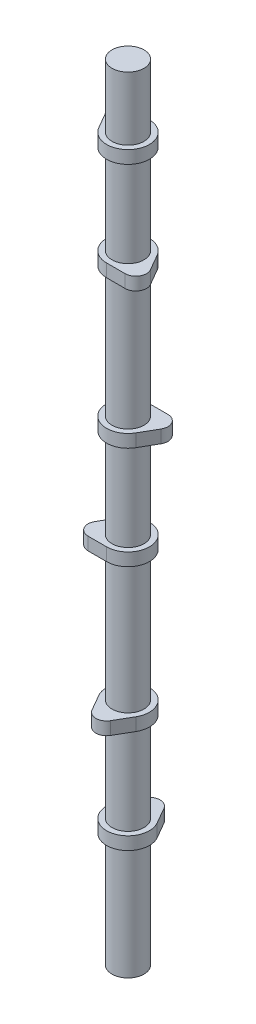
ISO-10303-21;
HEADER;
FILE_DESCRIPTION(('STEP AP214'),'2;1');
FILE_NAME('part.step','',(''),(''),'','','');
FILE_SCHEMA(('AUTOMOTIVE_DESIGN { 1 0 10303 214 1 1 1 1 }'));
ENDSEC;
DATA;
#1=APPLICATION_CONTEXT('core data for automotive mechanical design processes');
#2=APPLICATION_PROTOCOL_DEFINITION('international standard','automotive_design',2000,#1);
#3=PRODUCT_CONTEXT('',#1,'mechanical');
#4=PRODUCT('Part','Part','',(#3));
#5=PRODUCT_RELATED_PRODUCT_CATEGORY('part','',(#4));
#6=PRODUCT_DEFINITION_FORMATION('','',#4);
#7=PRODUCT_DEFINITION_CONTEXT('part definition',#1,'design');
#8=PRODUCT_DEFINITION('design','',#6,#7);
#9=PRODUCT_DEFINITION_SHAPE('','',#8);
#10=(LENGTH_UNIT() NAMED_UNIT(*) SI_UNIT(.MILLI.,.METRE.));
#11=(NAMED_UNIT(*) PLANE_ANGLE_UNIT() SI_UNIT($,.RADIAN.));
#12=(NAMED_UNIT(*) SI_UNIT($,.STERADIAN.) SOLID_ANGLE_UNIT());
#13=UNCERTAINTY_MEASURE_WITH_UNIT(LENGTH_MEASURE(1.E-05),#10,'distance_accuracy_value','');
#14=(GEOMETRIC_REPRESENTATION_CONTEXT(3) GLOBAL_UNCERTAINTY_ASSIGNED_CONTEXT((#13)) GLOBAL_UNIT_ASSIGNED_CONTEXT((#10,
#11,#12)) REPRESENTATION_CONTEXT('',''));
#15=CARTESIAN_POINT('',(0.,0.,0.));
#16=DIRECTION('',(0.,0.,1.));
#17=DIRECTION('',(1.,0.,0.));
#18=AXIS2_PLACEMENT_3D('',#15,#16,#17);
#19=CARTESIAN_POINT('',(0.,398.29,0.));
#20=DIRECTION('',(0.,-1.,0.));
#21=DIRECTION('',(0.,0.,-1.));
#22=AXIS2_PLACEMENT_3D('',#19,#20,#21);
#23=CYLINDRICAL_SURFACE('',#22,9.5);
#24=CARTESIAN_POINT('',(0.,214.63,0.));
#25=DIRECTION('',(0.,1.,0.));
#26=DIRECTION('',(0.,0.,1.));
#27=AXIS2_PLACEMENT_3D('',#24,#25,#26);
#28=CIRCLE('',#27,9.5);
#29=CARTESIAN_POINT('',(0.,214.63,9.5));
#30=VERTEX_POINT('',#29);
#31=EDGE_CURVE('E331',#30,#30,#28,.T.);
#32=ORIENTED_EDGE('',*,*,#31,.T.);
#33=EDGE_LOOP('',(#32));
#34=FACE_BOUND('',#33,.T.);
#35=CARTESIAN_POINT('',(0.,292.1,0.));
#36=DIRECTION('',(0.,1.,0.));
#37=DIRECTION('',(0.,0.,1.));
#38=AXIS2_PLACEMENT_3D('',#35,#36,#37);
#39=CIRCLE('',#38,9.5);
#40=CARTESIAN_POINT('',(0.,292.1,9.5));
#41=VERTEX_POINT('',#40);
#42=EDGE_CURVE('E11',#41,#41,#39,.T.);
#43=ORIENTED_EDGE('',*,*,#42,.F.);
#44=EDGE_LOOP('',(#43));
#45=FACE_BOUND('',#44,.T.);
#46=ADVANCED_FACE('F35',(#34,#45),#23,.T.);
#47=CARTESIAN_POINT('',(0.,68.58,0.));
#48=DIRECTION('',(0.,1.,0.));
#49=DIRECTION('',(0.,0.,1.));
#50=AXIS2_PLACEMENT_3D('',#47,#48,#49);
#51=CIRCLE('',#50,9.5);
#52=CARTESIAN_POINT('',(0.,68.58,9.5));
#53=VERTEX_POINT('',#52);
#54=EDGE_CURVE('E362',#53,#53,#51,.T.);
#55=ORIENTED_EDGE('',*,*,#54,.T.);
#56=EDGE_LOOP('',(#55));
#57=FACE_BOUND('',#56,.T.);
#58=CARTESIAN_POINT('',(0.,146.05,0.));
#59=DIRECTION('',(0.,1.,0.));
#60=DIRECTION('',(0.,0.,1.));
#61=AXIS2_PLACEMENT_3D('',#58,#59,#60);
#62=CIRCLE('',#61,9.5);
#63=CARTESIAN_POINT('',(0.,146.05,9.5));
#64=VERTEX_POINT('',#63);
#65=EDGE_CURVE('E404',#64,#64,#62,.T.);
#66=ORIENTED_EDGE('',*,*,#65,.F.);
#67=EDGE_LOOP('',(#66));
#68=FACE_BOUND('',#67,.T.);
#69=ADVANCED_FACE('F453',(#57,#68),#23,.T.);
#70=CARTESIAN_POINT('',(0.,7.62000000000002,0.));
#71=DIRECTION('',(0.,1.,0.));
#72=DIRECTION('',(0.,0.,1.));
#73=AXIS2_PLACEMENT_3D('',#70,#71,#72);
#74=CIRCLE('',#73,9.5);
#75=CARTESIAN_POINT('',(0.,7.62000000000002,9.5));
#76=VERTEX_POINT('',#75);
#77=EDGE_CURVE('E366',#76,#76,#74,.F.);
#78=ORIENTED_EDGE('',*,*,#77,.F.);
#79=EDGE_LOOP('',(#78));
#80=FACE_BOUND('',#79,.T.);
#81=CARTESIAN_POINT('',(0.,60.96,0.));
#82=DIRECTION('',(0.,1.,0.));
#83=DIRECTION('',(0.,0.,1.));
#84=AXIS2_PLACEMENT_3D('',#81,#82,#83);
#85=CIRCLE('',#84,9.5);
#86=CARTESIAN_POINT('',(0.,60.96,9.5));
#87=VERTEX_POINT('',#86);
#88=EDGE_CURVE('E396',#87,#87,#85,.T.);
#89=ORIENTED_EDGE('',*,*,#88,.F.);
#90=EDGE_LOOP('',(#89));
#91=FACE_BOUND('',#90,.T.);
#92=ADVANCED_FACE('F461',(#80,#91),#23,.T.);
#93=CARTESIAN_POINT('',(0.,7.62,-12.7));
#94=DIRECTION('',(0.,-1.,0.));
#95=DIRECTION('',(0.,0.,-1.));
#96=AXIS2_PLACEMENT_3D('',#93,#94,#95);
#97=CYLINDRICAL_SURFACE('',#96,6.35);
#98=CARTESIAN_POINT('',(0.,0.,-12.7));
#99=DIRECTION('',(0.,1.,0.));
#100=DIRECTION('',(0.,0.,1.));
#101=AXIS2_PLACEMENT_3D('',#98,#99,#100);
#102=CIRCLE('',#101,6.35);
#103=CARTESIAN_POINT('',(5.49926131403119,0.,-15.875));
#104=VERTEX_POINT('',#103);
#105=CARTESIAN_POINT('',(-5.49926131403118,0.,-15.875));
#106=VERTEX_POINT('',#105);
#107=EDGE_CURVE('E372',#104,#106,#102,.T.);
#108=ORIENTED_EDGE('',*,*,#107,.T.);
#109=DIRECTION('',(0.,-1.,0.));
#110=VECTOR('',#109,1.);
#111=CARTESIAN_POINT('',(-5.49926131403118,7.62,-15.875));
#112=LINE('',#111,#110);
#113=CARTESIAN_POINT('',(-5.49926131403118,7.62,-15.875));
#114=VERTEX_POINT('',#113);
#115=EDGE_CURVE('E391',#114,#106,#112,.T.);
#116=ORIENTED_EDGE('',*,*,#115,.F.);
#117=CARTESIAN_POINT('',(0.,7.62,-12.7));
#118=DIRECTION('',(0.,1.,0.));
#119=DIRECTION('',(0.,0.,1.));
#120=AXIS2_PLACEMENT_3D('',#117,#118,#119);
#121=CIRCLE('',#120,6.35);
#122=CARTESIAN_POINT('',(5.49926131403119,7.62,-15.875));
#123=VERTEX_POINT('',#122);
#124=EDGE_CURVE('E373',#123,#114,#121,.T.);
#125=ORIENTED_EDGE('',*,*,#124,.F.);
#126=DIRECTION('',(0.,-1.,0.));
#127=VECTOR('',#126,1.);
#128=CARTESIAN_POINT('',(5.49926131403119,7.62,-15.875));
#129=LINE('',#128,#127);
#130=EDGE_CURVE('E379',#123,#104,#129,.T.);
#131=ORIENTED_EDGE('',*,*,#130,.T.);
#132=EDGE_LOOP('',(#108,#116,#125,#131));
#133=FACE_BOUND('',#132,.T.);
#134=ADVANCED_FACE('F37',(#133),#97,.T.);
#135=CARTESIAN_POINT('',(-5.49926131403118,7.62,-15.875));
#136=DIRECTION('',(0.866025403784439,0.,0.5));
#137=DIRECTION('',(0.5,0.,-0.866025403784439));
#138=AXIS2_PLACEMENT_3D('',#135,#136,#137);
#139=PLANE('',#138);
#140=DIRECTION('',(-0.5,0.,0.866025403784439));
#141=VECTOR('',#140,1.);
#142=CARTESIAN_POINT('',(-5.49926131403118,0.,-15.875));
#143=LINE('',#142,#141);
#144=CARTESIAN_POINT('',(-10.9985226280624,0.,-6.35));
#145=VERTEX_POINT('',#144);
#146=EDGE_CURVE('E382',#106,#145,#143,.T.);
#147=ORIENTED_EDGE('',*,*,#146,.T.);
#148=DIRECTION('',(0.,-1.,0.));
#149=VECTOR('',#148,1.);
#150=CARTESIAN_POINT('',(-10.9985226280624,7.62,-6.35));
#151=LINE('',#150,#149);
#152=CARTESIAN_POINT('',(-10.9985226280624,7.62,-6.35));
#153=VERTEX_POINT('',#152);
#154=EDGE_CURVE('E389',#153,#145,#151,.T.);
#155=ORIENTED_EDGE('',*,*,#154,.F.);
#156=DIRECTION('',(-0.5,0.,0.866025403784439));
#157=VECTOR('',#156,1.);
#158=CARTESIAN_POINT('',(-5.49926131403118,7.62,-15.875));
#159=LINE('',#158,#157);
#160=EDGE_CURVE('E85',#114,#153,#159,.T.);
#161=ORIENTED_EDGE('',*,*,#160,.F.);
#162=ORIENTED_EDGE('',*,*,#115,.T.);
#163=EDGE_LOOP('',(#147,#155,#161,#162));
#164=FACE_BOUND('',#163,.T.);
#165=ADVANCED_FACE('F495',(#164),#139,.F.);
#166=CARTESIAN_POINT('',(0.,7.62,0.));
#167=DIRECTION('',(0.,-1.,0.));
#168=DIRECTION('',(0.,0.,-1.));
#169=AXIS2_PLACEMENT_3D('',#166,#167,#168);
#170=CYLINDRICAL_SURFACE('',#169,12.7);
#171=CARTESIAN_POINT('',(0.,0.,0.));
#172=DIRECTION('',(0.,1.,0.));
#173=DIRECTION('',(0.,0.,1.));
#174=AXIS2_PLACEMENT_3D('',#171,#172,#173);
#175=CIRCLE('',#174,12.7);
#176=CARTESIAN_POINT('',(10.9985226280624,0.,-6.35000000000001));
#177=VERTEX_POINT('',#176);
#178=EDGE_CURVE('E71',#145,#177,#175,.T.);
#179=ORIENTED_EDGE('',*,*,#178,.T.);
#180=DIRECTION('',(0.,-1.,0.));
#181=VECTOR('',#180,1.);
#182=CARTESIAN_POINT('',(10.9985226280624,7.62,-6.35000000000001));
#183=LINE('',#182,#181);
#184=CARTESIAN_POINT('',(10.9985226280624,7.62,-6.35000000000001));
#185=VERTEX_POINT('',#184);
#186=EDGE_CURVE('E387',#185,#177,#183,.T.);
#187=ORIENTED_EDGE('',*,*,#186,.F.);
#188=CARTESIAN_POINT('',(0.,7.62,0.));
#189=DIRECTION('',(0.,1.,0.));
#190=DIRECTION('',(0.,0.,1.));
#191=AXIS2_PLACEMENT_3D('',#188,#189,#190);
#192=CIRCLE('',#191,12.7);
#193=EDGE_CURVE('E376',#153,#185,#192,.T.);
#194=ORIENTED_EDGE('',*,*,#193,.F.);
#195=ORIENTED_EDGE('',*,*,#154,.T.);
#196=EDGE_LOOP('',(#179,#187,#194,#195));
#197=FACE_BOUND('',#196,.T.);
#198=ADVANCED_FACE('F854',(#197),#170,.T.);
#199=CARTESIAN_POINT('',(5.49926131403119,7.62,-15.875));
#200=DIRECTION('',(-0.866025403784439,0.,0.5));
#201=DIRECTION('',(0.5,0.,0.866025403784439));
#202=AXIS2_PLACEMENT_3D('',#199,#200,#201);
#203=PLANE('',#202);
#204=DIRECTION('',(-0.5,0.,-0.866025403784439));
#205=VECTOR('',#204,1.);
#206=CARTESIAN_POINT('',(5.49926131403119,0.,-15.875));
#207=LINE('',#206,#205);
#208=EDGE_CURVE('E77',#177,#104,#207,.T.);
#209=ORIENTED_EDGE('',*,*,#208,.T.);
#210=ORIENTED_EDGE('',*,*,#130,.F.);
#211=DIRECTION('',(-0.5,0.,-0.866025403784439));
#212=VECTOR('',#211,1.);
#213=CARTESIAN_POINT('',(5.49926131403119,7.62,-15.875));
#214=LINE('',#213,#212);
#215=EDGE_CURVE('E53',#185,#123,#214,.T.);
#216=ORIENTED_EDGE('',*,*,#215,.F.);
#217=ORIENTED_EDGE('',*,*,#186,.T.);
#218=EDGE_LOOP('',(#209,#210,#216,#217));
#219=FACE_BOUND('',#218,.T.);
#220=ADVANCED_FACE('F847',(#219),#203,.F.);
#221=CARTESIAN_POINT('',(0.,7.62,-12.7));
#222=DIRECTION('',(0.,1.,0.));
#223=DIRECTION('',(0.,0.,1.));
#224=AXIS2_PLACEMENT_3D('',#221,#222,#223);
#225=PLANE('',#224);
#226=ORIENTED_EDGE('',*,*,#77,.T.);
#227=EDGE_LOOP('',(#226));
#228=FACE_BOUND('',#227,.T.);
#229=ORIENTED_EDGE('',*,*,#124,.T.);
#230=ORIENTED_EDGE('',*,*,#160,.T.);
#231=ORIENTED_EDGE('',*,*,#193,.T.);
#232=ORIENTED_EDGE('',*,*,#215,.T.);
#233=EDGE_LOOP('',(#229,#230,#231,#232));
#234=FACE_BOUND('',#233,.T.);
#235=ADVANCED_FACE('F839',(#228,#234),#225,.T.);
#236=CARTESIAN_POINT('',(0.,0.,-12.7));
#237=DIRECTION('',(0.,1.,0.));
#238=DIRECTION('',(0.,0.,1.));
#239=AXIS2_PLACEMENT_3D('',#236,#237,#238);
#240=PLANE('',#239);
#241=CARTESIAN_POINT('',(0.,0.,0.));
#242=DIRECTION('',(0.,1.,0.));
#243=DIRECTION('',(0.,0.,1.));
#244=AXIS2_PLACEMENT_3D('',#241,#242,#243);
#245=CIRCLE('',#244,9.5);
#246=CARTESIAN_POINT('',(0.,0.,9.5));
#247=VERTEX_POINT('',#246);
#248=EDGE_CURVE('E393',#247,#247,#245,.F.);
#249=ORIENTED_EDGE('',*,*,#248,.F.);
#250=EDGE_LOOP('',(#249));
#251=FACE_BOUND('',#250,.T.);
#252=ORIENTED_EDGE('',*,*,#107,.F.);
#253=ORIENTED_EDGE('',*,*,#208,.F.);
#254=ORIENTED_EDGE('',*,*,#178,.F.);
#255=ORIENTED_EDGE('',*,*,#146,.F.);
#256=EDGE_LOOP('',(#252,#253,#254,#255));
#257=FACE_BOUND('',#256,.T.);
#258=ADVANCED_FACE('F487',(#251,#257),#240,.F.);
#259=CARTESIAN_POINT('',(0.,-67.8,0.));
#260=DIRECTION('',(0.,1.,0.));
#261=DIRECTION('',(0.,0.,1.));
#262=AXIS2_PLACEMENT_3D('',#259,#260,#261);
#263=PLANE('',#262);
#264=CARTESIAN_POINT('',(0.,-67.8,0.));
#265=DIRECTION('',(0.,1.,0.));
#266=DIRECTION('',(0.,0.,1.));
#267=AXIS2_PLACEMENT_3D('',#264,#265,#266);
#268=CIRCLE('',#267,9.5);
#269=CARTESIAN_POINT('',(0.,-67.8,9.5));
#270=VERTEX_POINT('',#269);
#271=EDGE_CURVE('E367',#270,#270,#268,.T.);
#272=ORIENTED_EDGE('',*,*,#271,.F.);
#273=EDGE_LOOP('',(#272));
#274=FACE_BOUND('',#273,.T.);
#275=ADVANCED_FACE('F478',(#274),#263,.F.);
#276=ORIENTED_EDGE('',*,*,#271,.T.);
#277=EDGE_LOOP('',(#276));
#278=FACE_BOUND('',#277,.T.);
#279=ORIENTED_EDGE('',*,*,#248,.T.);
#280=EDGE_LOOP('',(#279));
#281=FACE_BOUND('',#280,.T.);
#282=ADVANCED_FACE('F469',(#278,#281),#23,.T.);
#283=CARTESIAN_POINT('',(0.,68.58,12.7));
#284=DIRECTION('',(0.,-1.,0.));
#285=DIRECTION('',(0.,0.,1.));
#286=AXIS2_PLACEMENT_3D('',#283,#284,#285);
#287=CYLINDRICAL_SURFACE('',#286,6.35);
#288=CARTESIAN_POINT('',(0.,60.96,12.7));
#289=DIRECTION('',(0.,1.,0.));
#290=DIRECTION('',(0.,0.,-1.));
#291=AXIS2_PLACEMENT_3D('',#288,#289,#290);
#292=CIRCLE('',#291,6.35);
#293=CARTESIAN_POINT('',(-5.4992613140313,60.96,15.875));
#294=VERTEX_POINT('',#293);
#295=CARTESIAN_POINT('',(5.49926131403107,60.96,15.875));
#296=VERTEX_POINT('',#295);
#297=EDGE_CURVE('E343',#294,#296,#292,.T.);
#298=ORIENTED_EDGE('',*,*,#297,.T.);
#299=DIRECTION('',(0.,-1.,0.));
#300=VECTOR('',#299,1.);
#301=CARTESIAN_POINT('',(5.49926131403107,68.58,15.875));
#302=LINE('',#301,#300);
#303=CARTESIAN_POINT('',(5.49926131403107,68.58,15.875));
#304=VERTEX_POINT('',#303);
#305=EDGE_CURVE('E359',#304,#296,#302,.T.);
#306=ORIENTED_EDGE('',*,*,#305,.F.);
#307=CARTESIAN_POINT('',(0.,68.58,12.7));
#308=DIRECTION('',(0.,1.,0.));
#309=DIRECTION('',(0.,0.,-1.));
#310=AXIS2_PLACEMENT_3D('',#307,#308,#309);
#311=CIRCLE('',#310,6.35);
#312=CARTESIAN_POINT('',(-5.4992613140313,68.58,15.875));
#313=VERTEX_POINT('',#312);
#314=EDGE_CURVE('E332',#313,#304,#311,.T.);
#315=ORIENTED_EDGE('',*,*,#314,.F.);
#316=DIRECTION('',(0.,-1.,0.));
#317=VECTOR('',#316,1.);
#318=CARTESIAN_POINT('',(-5.4992613140313,68.58,15.875));
#319=LINE('',#318,#317);
#320=EDGE_CURVE('E342',#313,#294,#319,.T.);
#321=ORIENTED_EDGE('',*,*,#320,.T.);
#322=EDGE_LOOP('',(#298,#306,#315,#321));
#323=FACE_BOUND('',#322,.T.);
#324=ADVANCED_FACE('F477',(#323),#287,.T.);
#325=CARTESIAN_POINT('',(5.49926131403107,68.58,15.875));
#326=DIRECTION('',(-0.866025403784435,0.,-0.500000000000006));
#327=DIRECTION('',(-0.500000000000006,0.,0.866025403784435));
#328=AXIS2_PLACEMENT_3D('',#325,#326,#327);
#329=PLANE('',#328);
#330=DIRECTION('',(0.500000000000006,0.,-0.866025403784435));
#331=VECTOR('',#330,1.);
#332=CARTESIAN_POINT('',(5.49926131403107,60.96,15.875));
#333=LINE('',#332,#331);
#334=CARTESIAN_POINT('',(10.9985226280623,60.96,6.35000000000008));
#335=VERTEX_POINT('',#334);
#336=EDGE_CURVE('E346',#296,#335,#333,.T.);
#337=ORIENTED_EDGE('',*,*,#336,.T.);
#338=DIRECTION('',(0.,-1.,0.));
#339=VECTOR('',#338,1.);
#340=CARTESIAN_POINT('',(10.9985226280623,68.58,6.35000000000008));
#341=LINE('',#340,#339);
#342=CARTESIAN_POINT('',(10.9985226280623,68.58,6.35000000000008));
#343=VERTEX_POINT('',#342);
#344=EDGE_CURVE('E356',#343,#335,#341,.T.);
#345=ORIENTED_EDGE('',*,*,#344,.F.);
#346=DIRECTION('',(0.500000000000006,0.,-0.866025403784435));
#347=VECTOR('',#346,1.);
#348=CARTESIAN_POINT('',(5.49926131403107,68.58,15.875));
#349=LINE('',#348,#347);
#350=EDGE_CURVE('E335',#304,#343,#349,.T.);
#351=ORIENTED_EDGE('',*,*,#350,.F.);
#352=ORIENTED_EDGE('',*,*,#305,.T.);
#353=EDGE_LOOP('',(#337,#345,#351,#352));
#354=FACE_BOUND('',#353,.T.);
#355=ADVANCED_FACE('F484',(#354),#329,.F.);
#356=CARTESIAN_POINT('',(0.,68.58,0.));
#357=DIRECTION('',(0.,-1.,0.));
#358=DIRECTION('',(0.,0.,1.));
#359=AXIS2_PLACEMENT_3D('',#356,#357,#358);
#360=CYLINDRICAL_SURFACE('',#359,12.7);
#361=CARTESIAN_POINT('',(0.,60.96,0.));
#362=DIRECTION('',(0.,1.,0.));
#363=DIRECTION('',(0.,0.,-1.));
#364=AXIS2_PLACEMENT_3D('',#361,#362,#363);
#365=CIRCLE('',#364,12.7);
#366=CARTESIAN_POINT('',(-10.9985226280624,60.96,6.34999999999993));
#367=VERTEX_POINT('',#366);
#368=EDGE_CURVE('E348',#335,#367,#365,.T.);
#369=ORIENTED_EDGE('',*,*,#368,.T.);
#370=DIRECTION('',(0.,-1.,0.));
#371=VECTOR('',#370,1.);
#372=CARTESIAN_POINT('',(-10.9985226280624,68.58,6.34999999999993));
#373=LINE('',#372,#371);
#374=CARTESIAN_POINT('',(-10.9985226280624,68.58,6.34999999999993));
#375=VERTEX_POINT('',#374);
#376=EDGE_CURVE('E353',#375,#367,#373,.T.);
#377=ORIENTED_EDGE('',*,*,#376,.F.);
#378=CARTESIAN_POINT('',(0.,68.58,0.));
#379=DIRECTION('',(0.,1.,0.));
#380=DIRECTION('',(0.,0.,-1.));
#381=AXIS2_PLACEMENT_3D('',#378,#379,#380);
#382=CIRCLE('',#381,12.7);
#383=EDGE_CURVE('E338',#343,#375,#382,.T.);
#384=ORIENTED_EDGE('',*,*,#383,.F.);
#385=ORIENTED_EDGE('',*,*,#344,.T.);
#386=EDGE_LOOP('',(#369,#377,#384,#385));
#387=FACE_BOUND('',#386,.T.);
#388=ADVANCED_FACE('F567',(#387),#360,.T.);
#389=CARTESIAN_POINT('',(-5.4992613140313,68.58,15.875));
#390=DIRECTION('',(0.866025403784442,0.,-0.499999999999994));
#391=DIRECTION('',(-0.499999999999994,0.,-0.866025403784442));
#392=AXIS2_PLACEMENT_3D('',#389,#390,#391);
#393=PLANE('',#392);
#394=DIRECTION('',(0.499999999999994,0.,0.866025403784442));
#395=VECTOR('',#394,1.);
#396=CARTESIAN_POINT('',(-5.4992613140313,60.96,15.875));
#397=LINE('',#396,#395);
#398=EDGE_CURVE('E336',#367,#294,#397,.T.);
#399=ORIENTED_EDGE('',*,*,#398,.T.);
#400=ORIENTED_EDGE('',*,*,#320,.F.);
#401=DIRECTION('',(0.499999999999994,0.,0.866025403784442));
#402=VECTOR('',#401,1.);
#403=CARTESIAN_POINT('',(-5.4992613140313,68.58,15.875));
#404=LINE('',#403,#402);
#405=EDGE_CURVE('E340',#375,#313,#404,.T.);
#406=ORIENTED_EDGE('',*,*,#405,.F.);
#407=ORIENTED_EDGE('',*,*,#376,.T.);
#408=EDGE_LOOP('',(#399,#400,#406,#407));
#409=FACE_BOUND('',#408,.T.);
#410=ADVANCED_FACE('F560',(#409),#393,.F.);
#411=CARTESIAN_POINT('',(0.,68.58,12.7));
#412=DIRECTION('',(0.,1.,0.));
#413=DIRECTION('',(0.,0.,-1.));
#414=AXIS2_PLACEMENT_3D('',#411,#412,#413);
#415=PLANE('',#414);
#416=ORIENTED_EDGE('',*,*,#54,.F.);
#417=EDGE_LOOP('',(#416));
#418=FACE_BOUND('',#417,.T.);
#419=ORIENTED_EDGE('',*,*,#314,.T.);
#420=ORIENTED_EDGE('',*,*,#350,.T.);
#421=ORIENTED_EDGE('',*,*,#383,.T.);
#422=ORIENTED_EDGE('',*,*,#405,.T.);
#423=EDGE_LOOP('',(#419,#420,#421,#422));
#424=FACE_BOUND('',#423,.T.);
#425=ADVANCED_FACE('F556',(#418,#424),#415,.T.);
#426=CARTESIAN_POINT('',(0.,60.96,12.7));
#427=DIRECTION('',(0.,1.,0.));
#428=DIRECTION('',(0.,0.,-1.));
#429=AXIS2_PLACEMENT_3D('',#426,#427,#428);
#430=PLANE('',#429);
#431=ORIENTED_EDGE('',*,*,#88,.T.);
#432=EDGE_LOOP('',(#431));
#433=FACE_BOUND('',#432,.T.);
#434=ORIENTED_EDGE('',*,*,#297,.F.);
#435=ORIENTED_EDGE('',*,*,#398,.F.);
#436=ORIENTED_EDGE('',*,*,#368,.F.);
#437=ORIENTED_EDGE('',*,*,#336,.F.);
#438=EDGE_LOOP('',(#434,#435,#436,#437));
#439=FACE_BOUND('',#438,.T.);
#440=ADVANCED_FACE('F559',(#433,#439),#430,.F.);
#441=CARTESIAN_POINT('',(-10.9985226280623,153.67,6.35000000000005));
#442=DIRECTION('',(0.,-1.,0.));
#443=DIRECTION('',(-0.866025403784436,0.,0.500000000000004));
#444=AXIS2_PLACEMENT_3D('',#441,#442,#443);
#445=CYLINDRICAL_SURFACE('',#444,6.35);
#446=CARTESIAN_POINT('',(-10.9985226280623,146.05,6.35000000000005));
#447=DIRECTION('',(0.,1.,0.));
#448=DIRECTION('',(0.866025403784436,0.,-0.500000000000004));
#449=AXIS2_PLACEMENT_3D('',#446,#447,#448);
#450=CIRCLE('',#449,6.35);
#451=CARTESIAN_POINT('',(-16.4977839420935,146.05,3.17500000000008));
#452=VERTEX_POINT('',#451);
#453=CARTESIAN_POINT('',(-10.9985226280623,146.05,12.7000000000001));
#454=VERTEX_POINT('',#453);
#455=EDGE_CURVE('E281',#452,#454,#450,.T.);
#456=ORIENTED_EDGE('',*,*,#455,.T.);
#457=DIRECTION('',(0.,-1.,0.));
#458=VECTOR('',#457,1.);
#459=CARTESIAN_POINT('',(-10.9985226280623,153.67,12.7000000000001));
#460=LINE('',#459,#458);
#461=CARTESIAN_POINT('',(-10.9985226280623,153.67,12.7000000000001));
#462=VERTEX_POINT('',#461);
#463=EDGE_CURVE('E297',#462,#454,#460,.T.);
#464=ORIENTED_EDGE('',*,*,#463,.F.);
#465=CARTESIAN_POINT('',(-10.9985226280623,153.67,6.35000000000005));
#466=DIRECTION('',(0.,1.,0.));
#467=DIRECTION('',(0.866025403784436,0.,-0.500000000000004));
#468=AXIS2_PLACEMENT_3D('',#465,#466,#467);
#469=CIRCLE('',#468,6.35);
#470=CARTESIAN_POINT('',(-16.4977839420935,153.67,3.17500000000008));
#471=VERTEX_POINT('',#470);
#472=EDGE_CURVE('E270',#471,#462,#469,.T.);
#473=ORIENTED_EDGE('',*,*,#472,.F.);
#474=DIRECTION('',(0.,-1.,0.));
#475=VECTOR('',#474,1.);
#476=CARTESIAN_POINT('',(-16.4977839420935,153.67,3.17500000000008));
#477=LINE('',#476,#475);
#478=EDGE_CURVE('E280',#471,#452,#477,.T.);
#479=ORIENTED_EDGE('',*,*,#478,.T.);
#480=EDGE_LOOP('',(#456,#464,#473,#479));
#481=FACE_BOUND('',#480,.T.);
#482=ADVANCED_FACE('F547',(#481),#445,.T.);
#483=CARTESIAN_POINT('',(-10.9985226280623,153.67,12.7000000000001));
#484=DIRECTION('',(0.,0.,-1.));
#485=DIRECTION('',(-1.,0.,0.));
#486=AXIS2_PLACEMENT_3D('',#483,#484,#485);
#487=PLANE('',#486);
#488=DIRECTION('',(1.,0.,0.));
#489=VECTOR('',#488,1.);
#490=CARTESIAN_POINT('',(-10.9985226280623,146.05,12.7000000000001));
#491=LINE('',#490,#489);
#492=CARTESIAN_POINT('',(0.,146.05,12.7));
#493=VERTEX_POINT('',#492);
#494=EDGE_CURVE('E284',#454,#493,#491,.T.);
#495=ORIENTED_EDGE('',*,*,#494,.T.);
#496=DIRECTION('',(0.,-1.,0.));
#497=VECTOR('',#496,1.);
#498=CARTESIAN_POINT('',(0.,153.67,12.7));
#499=LINE('',#498,#497);
#500=CARTESIAN_POINT('',(0.,153.67,12.7));
#501=VERTEX_POINT('',#500);
#502=EDGE_CURVE('E294',#501,#493,#499,.T.);
#503=ORIENTED_EDGE('',*,*,#502,.F.);
#504=DIRECTION('',(1.,0.,0.));
#505=VECTOR('',#504,1.);
#506=CARTESIAN_POINT('',(-10.9985226280623,153.67,12.7000000000001));
#507=LINE('',#506,#505);
#508=EDGE_CURVE('E273',#462,#501,#507,.T.);
#509=ORIENTED_EDGE('',*,*,#508,.F.);
#510=ORIENTED_EDGE('',*,*,#463,.T.);
#511=EDGE_LOOP('',(#495,#503,#509,#510));
#512=FACE_BOUND('',#511,.T.);
#513=ADVANCED_FACE('F612',(#512),#487,.F.);
#514=CARTESIAN_POINT('',(0.,153.67,0.));
#515=DIRECTION('',(0.,-1.,0.));
#516=DIRECTION('',(-0.866025403784436,0.,0.500000000000004));
#517=AXIS2_PLACEMENT_3D('',#514,#515,#516);
#518=CYLINDRICAL_SURFACE('',#517,12.7);
#519=CARTESIAN_POINT('',(0.,146.05,0.));
#520=DIRECTION('',(0.,1.,0.));
#521=DIRECTION('',(0.866025403784436,0.,-0.500000000000004));
#522=AXIS2_PLACEMENT_3D('',#519,#520,#521);
#523=CIRCLE('',#522,12.7);
#524=CARTESIAN_POINT('',(-10.9985226280624,146.05,-6.34999999999994));
#525=VERTEX_POINT('',#524);
#526=EDGE_CURVE('E286',#493,#525,#523,.T.);
#527=ORIENTED_EDGE('',*,*,#526,.T.);
#528=DIRECTION('',(0.,-1.,0.));
#529=VECTOR('',#528,1.);
#530=CARTESIAN_POINT('',(-10.9985226280624,153.67,-6.34999999999994));
#531=LINE('',#530,#529);
#532=CARTESIAN_POINT('',(-10.9985226280624,153.67,-6.34999999999994));
#533=VERTEX_POINT('',#532);
#534=EDGE_CURVE('E291',#533,#525,#531,.T.);
#535=ORIENTED_EDGE('',*,*,#534,.F.);
#536=CARTESIAN_POINT('',(0.,153.67,0.));
#537=DIRECTION('',(0.,1.,0.));
#538=DIRECTION('',(0.866025403784436,0.,-0.500000000000004));
#539=AXIS2_PLACEMENT_3D('',#536,#537,#538);
#540=CIRCLE('',#539,12.7);
#541=EDGE_CURVE('E276',#501,#533,#540,.T.);
#542=ORIENTED_EDGE('',*,*,#541,.F.);
#543=ORIENTED_EDGE('',*,*,#502,.T.);
#544=EDGE_LOOP('',(#527,#535,#542,#543));
#545=FACE_BOUND('',#544,.T.);
#546=ADVANCED_FACE('F619',(#545),#518,.T.);
#547=CARTESIAN_POINT('',(-16.4977839420935,153.67,3.17500000000008));
#548=DIRECTION('',(0.866025403784441,0.,0.499999999999996));
#549=DIRECTION('',(0.499999999999996,0.,-0.866025403784441));
#550=AXIS2_PLACEMENT_3D('',#547,#548,#549);
#551=PLANE('',#550);
#552=DIRECTION('',(-0.499999999999996,0.,0.866025403784441));
#553=VECTOR('',#552,1.);
#554=CARTESIAN_POINT('',(-16.4977839420935,146.05,3.17500000000008));
#555=LINE('',#554,#553);
#556=EDGE_CURVE('E274',#525,#452,#555,.T.);
#557=ORIENTED_EDGE('',*,*,#556,.T.);
#558=ORIENTED_EDGE('',*,*,#478,.F.);
#559=DIRECTION('',(-0.499999999999996,0.,0.866025403784441));
#560=VECTOR('',#559,1.);
#561=CARTESIAN_POINT('',(-16.4977839420935,153.67,3.17500000000008));
#562=LINE('',#561,#560);
#563=EDGE_CURVE('E278',#533,#471,#562,.T.);
#564=ORIENTED_EDGE('',*,*,#563,.F.);
#565=ORIENTED_EDGE('',*,*,#534,.T.);
#566=EDGE_LOOP('',(#557,#558,#564,#565));
#567=FACE_BOUND('',#566,.T.);
#568=ADVANCED_FACE('F626',(#567),#551,.F.);
#569=CARTESIAN_POINT('',(-10.9985226280623,153.67,6.35000000000005));
#570=DIRECTION('',(0.,1.,0.));
#571=DIRECTION('',(0.866025403784436,0.,-0.500000000000004));
#572=AXIS2_PLACEMENT_3D('',#569,#570,#571);
#573=PLANE('',#572);
#574=CARTESIAN_POINT('',(0.,153.67,0.));
#575=DIRECTION('',(0.,1.,0.));
#576=DIRECTION('',(0.,0.,1.));
#577=AXIS2_PLACEMENT_3D('',#574,#575,#576);
#578=CIRCLE('',#577,9.5);
#579=CARTESIAN_POINT('',(0.,153.67,9.5));
#580=VERTEX_POINT('',#579);
#581=EDGE_CURVE('E300',#580,#580,#578,.T.);
#582=ORIENTED_EDGE('',*,*,#581,.F.);
#583=EDGE_LOOP('',(#582));
#584=FACE_BOUND('',#583,.T.);
#585=ORIENTED_EDGE('',*,*,#472,.T.);
#586=ORIENTED_EDGE('',*,*,#508,.T.);
#587=ORIENTED_EDGE('',*,*,#541,.T.);
#588=ORIENTED_EDGE('',*,*,#563,.T.);
#589=EDGE_LOOP('',(#585,#586,#587,#588));
#590=FACE_BOUND('',#589,.T.);
#591=ADVANCED_FACE('F542',(#584,#590),#573,.T.);
#592=CARTESIAN_POINT('',(-10.9985226280623,146.05,6.35000000000005));
#593=DIRECTION('',(0.,1.,0.));
#594=DIRECTION('',(0.866025403784436,0.,-0.500000000000004));
#595=AXIS2_PLACEMENT_3D('',#592,#593,#594);
#596=PLANE('',#595);
#597=ORIENTED_EDGE('',*,*,#65,.T.);
#598=EDGE_LOOP('',(#597));
#599=FACE_BOUND('',#598,.T.);
#600=ORIENTED_EDGE('',*,*,#455,.F.);
#601=ORIENTED_EDGE('',*,*,#556,.F.);
#602=ORIENTED_EDGE('',*,*,#526,.F.);
#603=ORIENTED_EDGE('',*,*,#494,.F.);
#604=EDGE_LOOP('',(#600,#601,#602,#603));
#605=FACE_BOUND('',#604,.T.);
#606=ADVANCED_FACE('F534',(#599,#605),#596,.F.);
#607=CARTESIAN_POINT('',(10.9985226280624,214.63,-6.34999999999997));
#608=DIRECTION('',(0.,1.,0.));
#609=DIRECTION('',(-0.86602540378444,0.,0.499999999999998));
#610=AXIS2_PLACEMENT_3D('',#607,#608,#609);
#611=PLANE('',#610);
#612=ORIENTED_EDGE('',*,*,#31,.F.);
#613=EDGE_LOOP('',(#612));
#614=FACE_BOUND('',#613,.T.);
#615=CARTESIAN_POINT('',(10.9985226280624,214.63,-6.34999999999997));
#616=DIRECTION('',(0.,1.,0.));
#617=DIRECTION('',(-0.86602540378444,0.,0.499999999999998));
#618=AXIS2_PLACEMENT_3D('',#615,#616,#617);
#619=CIRCLE('',#618,6.35);
#620=CARTESIAN_POINT('',(16.4977839420936,214.63,-3.17499999999996));
#621=VERTEX_POINT('',#620);
#622=CARTESIAN_POINT('',(10.9985226280624,214.63,-12.7));
#623=VERTEX_POINT('',#622);
#624=EDGE_CURVE('E301',#621,#623,#619,.T.);
#625=ORIENTED_EDGE('',*,*,#624,.T.);
#626=DIRECTION('',(-1.,0.,0.));
#627=VECTOR('',#626,1.);
#628=CARTESIAN_POINT('',(10.9985226280624,214.63,-12.7));
#629=LINE('',#628,#627);
#630=CARTESIAN_POINT('',(0.,214.63,-12.7));
#631=VERTEX_POINT('',#630);
#632=EDGE_CURVE('E304',#623,#631,#629,.T.);
#633=ORIENTED_EDGE('',*,*,#632,.T.);
#634=CARTESIAN_POINT('',(0.,214.63,0.));
#635=DIRECTION('',(0.,1.,0.));
#636=DIRECTION('',(-0.86602540378444,0.,0.499999999999998));
#637=AXIS2_PLACEMENT_3D('',#634,#635,#636);
#638=CIRCLE('',#637,12.7);
#639=CARTESIAN_POINT('',(10.9985226280624,214.63,6.35000000000001));
#640=VERTEX_POINT('',#639);
#641=EDGE_CURVE('E307',#631,#640,#638,.T.);
#642=ORIENTED_EDGE('',*,*,#641,.T.);
#643=DIRECTION('',(0.500000000000002,0.,-0.866025403784437));
#644=VECTOR('',#643,1.);
#645=CARTESIAN_POINT('',(16.4977839420936,214.63,-3.17499999999996));
#646=LINE('',#645,#644);
#647=EDGE_CURVE('E309',#640,#621,#646,.T.);
#648=ORIENTED_EDGE('',*,*,#647,.T.);
#649=EDGE_LOOP('',(#625,#633,#642,#648));
#650=FACE_BOUND('',#649,.T.);
#651=ADVANCED_FACE('F532',(#614,#650),#611,.T.);
#652=CARTESIAN_POINT('',(10.9985226280624,214.63,-12.7));
#653=DIRECTION('',(0.,0.,1.));
#654=DIRECTION('',(1.,0.,0.));
#655=AXIS2_PLACEMENT_3D('',#652,#653,#654);
#656=PLANE('',#655);
#657=DIRECTION('',(-1.,0.,0.));
#658=VECTOR('',#657,1.);
#659=CARTESIAN_POINT('',(10.9985226280624,207.01,-12.7));
#660=LINE('',#659,#658);
#661=CARTESIAN_POINT('',(10.9985226280624,207.01,-12.7));
#662=VERTEX_POINT('',#661);
#663=CARTESIAN_POINT('',(0.,207.01,-12.7));
#664=VERTEX_POINT('',#663);
#665=EDGE_CURVE('E315',#662,#664,#660,.T.);
#666=ORIENTED_EDGE('',*,*,#665,.T.);
#667=DIRECTION('',(0.,-1.,0.));
#668=VECTOR('',#667,1.);
#669=CARTESIAN_POINT('',(0.,214.63,-12.7));
#670=LINE('',#669,#668);
#671=EDGE_CURVE('E325',#631,#664,#670,.T.);
#672=ORIENTED_EDGE('',*,*,#671,.F.);
#673=ORIENTED_EDGE('',*,*,#632,.F.);
#674=DIRECTION('',(0.,-1.,0.));
#675=VECTOR('',#674,1.);
#676=CARTESIAN_POINT('',(10.9985226280624,214.63,-12.7));
#677=LINE('',#676,#675);
#678=EDGE_CURVE('E328',#623,#662,#677,.T.);
#679=ORIENTED_EDGE('',*,*,#678,.T.);
#680=EDGE_LOOP('',(#666,#672,#673,#679));
#681=FACE_BOUND('',#680,.T.);
#682=ADVANCED_FACE('F530',(#681),#656,.F.);
#683=CARTESIAN_POINT('',(0.,214.63,0.));
#684=DIRECTION('',(0.,-1.,0.));
#685=DIRECTION('',(0.86602540378444,0.,-0.499999999999998));
#686=AXIS2_PLACEMENT_3D('',#683,#684,#685);
#687=CYLINDRICAL_SURFACE('',#686,12.7);
#688=CARTESIAN_POINT('',(0.,207.01,0.));
#689=DIRECTION('',(0.,1.,0.));
#690=DIRECTION('',(-0.86602540378444,0.,0.499999999999998));
#691=AXIS2_PLACEMENT_3D('',#688,#689,#690);
#692=CIRCLE('',#691,12.7);
#693=CARTESIAN_POINT('',(10.9985226280624,207.01,6.35000000000001));
#694=VERTEX_POINT('',#693);
#695=EDGE_CURVE('E317',#664,#694,#692,.T.);
#696=ORIENTED_EDGE('',*,*,#695,.T.);
#697=DIRECTION('',(0.,-1.,0.));
#698=VECTOR('',#697,1.);
#699=CARTESIAN_POINT('',(10.9985226280624,214.63,6.35000000000001));
#700=LINE('',#699,#698);
#701=EDGE_CURVE('E322',#640,#694,#700,.T.);
#702=ORIENTED_EDGE('',*,*,#701,.F.);
#703=ORIENTED_EDGE('',*,*,#641,.F.);
#704=ORIENTED_EDGE('',*,*,#671,.T.);
#705=EDGE_LOOP('',(#696,#702,#703,#704));
#706=FACE_BOUND('',#705,.T.);
#707=ADVANCED_FACE('F527',(#706),#687,.T.);
#708=CARTESIAN_POINT('',(16.4977839420936,214.63,-3.17499999999996));
#709=DIRECTION('',(-0.866025403784437,0.,-0.500000000000002));
#710=DIRECTION('',(-0.500000000000002,0.,0.866025403784437));
#711=AXIS2_PLACEMENT_3D('',#708,#709,#710);
#712=PLANE('',#711);
#713=DIRECTION('',(0.500000000000002,0.,-0.866025403784437));
#714=VECTOR('',#713,1.);
#715=CARTESIAN_POINT('',(16.4977839420936,207.01,-3.17499999999996));
#716=LINE('',#715,#714);
#717=CARTESIAN_POINT('',(16.4977839420936,207.01,-3.17499999999996));
#718=VERTEX_POINT('',#717);
#719=EDGE_CURVE('E305',#694,#718,#716,.T.);
#720=ORIENTED_EDGE('',*,*,#719,.T.);
#721=DIRECTION('',(0.,-1.,0.));
#722=VECTOR('',#721,1.);
#723=CARTESIAN_POINT('',(16.4977839420936,214.63,-3.17499999999996));
#724=LINE('',#723,#722);
#725=EDGE_CURVE('E311',#621,#718,#724,.T.);
#726=ORIENTED_EDGE('',*,*,#725,.F.);
#727=ORIENTED_EDGE('',*,*,#647,.F.);
#728=ORIENTED_EDGE('',*,*,#701,.T.);
#729=EDGE_LOOP('',(#720,#726,#727,#728));
#730=FACE_BOUND('',#729,.T.);
#731=ADVANCED_FACE('F523',(#730),#712,.F.);
#732=CARTESIAN_POINT('',(10.9985226280624,214.63,-6.34999999999997));
#733=DIRECTION('',(0.,-1.,0.));
#734=DIRECTION('',(0.86602540378444,0.,-0.499999999999998));
#735=AXIS2_PLACEMENT_3D('',#732,#733,#734);
#736=CYLINDRICAL_SURFACE('',#735,6.35);
#737=CARTESIAN_POINT('',(10.9985226280624,207.01,-6.34999999999997));
#738=DIRECTION('',(0.,1.,0.));
#739=DIRECTION('',(-0.86602540378444,0.,0.499999999999998));
#740=AXIS2_PLACEMENT_3D('',#737,#738,#739);
#741=CIRCLE('',#740,6.35);
#742=EDGE_CURVE('E312',#718,#662,#741,.T.);
#743=ORIENTED_EDGE('',*,*,#742,.T.);
#744=ORIENTED_EDGE('',*,*,#678,.F.);
#745=ORIENTED_EDGE('',*,*,#624,.F.);
#746=ORIENTED_EDGE('',*,*,#725,.T.);
#747=EDGE_LOOP('',(#743,#744,#745,#746));
#748=FACE_BOUND('',#747,.T.);
#749=ADVANCED_FACE('F507',(#748),#736,.T.);
#750=CARTESIAN_POINT('',(10.9985226280624,207.01,-6.34999999999997));
#751=DIRECTION('',(0.,1.,0.));
#752=DIRECTION('',(-0.86602540378444,0.,0.499999999999998));
#753=AXIS2_PLACEMENT_3D('',#750,#751,#752);
#754=PLANE('',#753);
#755=CARTESIAN_POINT('',(0.,207.01,0.));
#756=DIRECTION('',(0.,1.,0.));
#757=DIRECTION('',(0.,0.,1.));
#758=AXIS2_PLACEMENT_3D('',#755,#756,#757);
#759=CIRCLE('',#758,9.5);
#760=CARTESIAN_POINT('',(0.,207.01,9.5));
#761=VERTEX_POINT('',#760);
#762=EDGE_CURVE('E399',#761,#761,#759,.T.);
#763=ORIENTED_EDGE('',*,*,#762,.T.);
#764=EDGE_LOOP('',(#763));
#765=FACE_BOUND('',#764,.T.);
#766=ORIENTED_EDGE('',*,*,#742,.F.);
#767=ORIENTED_EDGE('',*,*,#719,.F.);
#768=ORIENTED_EDGE('',*,*,#695,.F.);
#769=ORIENTED_EDGE('',*,*,#665,.F.);
#770=EDGE_LOOP('',(#766,#767,#768,#769));
#771=FACE_BOUND('',#770,.T.);
#772=ADVANCED_FACE('F500',(#765,#771),#754,.F.);
#773=ORIENTED_EDGE('',*,*,#581,.T.);
#774=EDGE_LOOP('',(#773));
#775=FACE_BOUND('',#774,.T.);
#776=ORIENTED_EDGE('',*,*,#762,.F.);
#777=EDGE_LOOP('',(#776));
#778=FACE_BOUND('',#777,.T.);
#779=ADVANCED_FACE('F463',(#775,#778),#23,.T.);
#780=CARTESIAN_POINT('',(10.9985226280624,299.72,6.3499999999999));
#781=DIRECTION('',(0.,-1.,0.));
#782=DIRECTION('',(0.866025403784443,0.,0.499999999999992));
#783=AXIS2_PLACEMENT_3D('',#780,#781,#782);
#784=CYLINDRICAL_SURFACE('',#783,6.35);
#785=CARTESIAN_POINT('',(10.9985226280624,292.1,6.3499999999999));
#786=DIRECTION('',(0.,1.,0.));
#787=DIRECTION('',(-0.866025403784443,0.,-0.499999999999992));
#788=AXIS2_PLACEMENT_3D('',#785,#786,#787);
#789=CIRCLE('',#788,6.35);
#790=CARTESIAN_POINT('',(10.9985226280625,292.1,12.6999999999999));
#791=VERTEX_POINT('',#790);
#792=CARTESIAN_POINT('',(16.4977839420936,292.1,3.17499999999985));
#793=VERTEX_POINT('',#792);
#794=EDGE_CURVE('E232',#791,#793,#789,.T.);
#795=ORIENTED_EDGE('',*,*,#794,.T.);
#796=DIRECTION('',(0.,-1.,0.));
#797=VECTOR('',#796,1.);
#798=CARTESIAN_POINT('',(16.4977839420936,299.72,3.17499999999985));
#799=LINE('',#798,#797);
#800=CARTESIAN_POINT('',(16.4977839420936,299.72,3.17499999999985));
#801=VERTEX_POINT('',#800);
#802=EDGE_CURVE('E212',#801,#793,#799,.T.);
#803=ORIENTED_EDGE('',*,*,#802,.F.);
#804=CARTESIAN_POINT('',(10.9985226280624,299.72,6.3499999999999));
#805=DIRECTION('',(0.,1.,0.));
#806=DIRECTION('',(-0.866025403784443,0.,-0.499999999999992));
#807=AXIS2_PLACEMENT_3D('',#804,#805,#806);
#808=CIRCLE('',#807,6.35);
#809=CARTESIAN_POINT('',(10.9985226280625,299.72,12.6999999999999));
#810=VERTEX_POINT('',#809);
#811=EDGE_CURVE('E219',#810,#801,#808,.T.);
#812=ORIENTED_EDGE('',*,*,#811,.F.);
#813=DIRECTION('',(0.,-1.,0.));
#814=VECTOR('',#813,1.);
#815=CARTESIAN_POINT('',(10.9985226280625,299.72,12.6999999999999));
#816=LINE('',#815,#814);
#817=EDGE_CURVE('E901',#810,#791,#816,.T.);
#818=ORIENTED_EDGE('',*,*,#817,.T.);
#819=EDGE_LOOP('',(#795,#803,#812,#818));
#820=FACE_BOUND('',#819,.T.);
#821=ADVANCED_FACE('F230',(#820),#784,.T.);
#822=CARTESIAN_POINT('',(16.4977839420936,299.72,3.17499999999985));
#823=DIRECTION('',(-0.866025403784434,0.,0.500000000000008));
#824=DIRECTION('',(0.500000000000008,0.,0.866025403784434));
#825=AXIS2_PLACEMENT_3D('',#822,#823,#824);
#826=PLANE('',#825);
#827=DIRECTION('',(-0.500000000000008,0.,-0.866025403784434));
#828=VECTOR('',#827,1.);
#829=CARTESIAN_POINT('',(16.4977839420936,292.1,3.17499999999985));
#830=LINE('',#829,#828);
#831=CARTESIAN_POINT('',(10.9985226280623,292.1,-6.3500000000001));
#832=VERTEX_POINT('',#831);
#833=EDGE_CURVE('E892',#793,#832,#830,.T.);
#834=ORIENTED_EDGE('',*,*,#833,.T.);
#835=DIRECTION('',(0.,-1.,0.));
#836=VECTOR('',#835,1.);
#837=CARTESIAN_POINT('',(10.9985226280623,299.72,-6.3500000000001));
#838=LINE('',#837,#836);
#839=CARTESIAN_POINT('',(10.9985226280623,299.72,-6.3500000000001));
#840=VERTEX_POINT('',#839);
#841=EDGE_CURVE('E215',#840,#832,#838,.T.);
#842=ORIENTED_EDGE('',*,*,#841,.F.);
#843=DIRECTION('',(-0.500000000000008,0.,-0.866025403784434));
#844=VECTOR('',#843,1.);
#845=CARTESIAN_POINT('',(16.4977839420936,299.72,3.17499999999985));
#846=LINE('',#845,#844);
#847=EDGE_CURVE('E208',#801,#840,#846,.T.);
#848=ORIENTED_EDGE('',*,*,#847,.F.);
#849=ORIENTED_EDGE('',*,*,#802,.T.);
#850=EDGE_LOOP('',(#834,#842,#848,#849));
#851=FACE_BOUND('',#850,.T.);
#852=ADVANCED_FACE('F210',(#851),#826,.F.);
#853=CARTESIAN_POINT('',(0.,299.72,0.));
#854=DIRECTION('',(0.,-1.,0.));
#855=DIRECTION('',(0.866025403784443,0.,0.499999999999992));
#856=AXIS2_PLACEMENT_3D('',#853,#854,#855);
#857=CYLINDRICAL_SURFACE('',#856,12.7);
#858=CARTESIAN_POINT('',(0.,292.1,0.));
#859=DIRECTION('',(0.,1.,0.));
#860=DIRECTION('',(-0.866025403784443,0.,-0.499999999999992));
#861=AXIS2_PLACEMENT_3D('',#858,#859,#860);
#862=CIRCLE('',#861,12.7);
#863=CARTESIAN_POINT('',(1.32706345912226E-13,292.1,12.7));
#864=VERTEX_POINT('',#863);
#865=EDGE_CURVE('E894',#832,#864,#862,.T.);
#866=ORIENTED_EDGE('',*,*,#865,.T.);
#867=DIRECTION('',(0.,-1.,0.));
#868=VECTOR('',#867,1.);
#869=CARTESIAN_POINT('',(1.32706345912226E-13,299.72,12.7));
#870=LINE('',#869,#868);
#871=CARTESIAN_POINT('',(1.32706345912226E-13,299.72,12.7));
#872=VERTEX_POINT('',#871);
#873=EDGE_CURVE('E236',#872,#864,#870,.T.);
#874=ORIENTED_EDGE('',*,*,#873,.F.);
#875=CARTESIAN_POINT('',(0.,299.72,0.));
#876=DIRECTION('',(0.,1.,0.));
#877=DIRECTION('',(-0.866025403784443,0.,-0.499999999999992));
#878=AXIS2_PLACEMENT_3D('',#875,#876,#877);
#879=CIRCLE('',#878,12.7);
#880=EDGE_CURVE('E218',#840,#872,#879,.T.);
#881=ORIENTED_EDGE('',*,*,#880,.F.);
#882=ORIENTED_EDGE('',*,*,#841,.T.);
#883=EDGE_LOOP('',(#866,#874,#881,#882));
#884=FACE_BOUND('',#883,.T.);
#885=ADVANCED_FACE('F703',(#884),#857,.T.);
#886=CARTESIAN_POINT('',(10.9985226280625,299.72,12.6999999999999));
#887=DIRECTION('',(0.,0.,-1.));
#888=DIRECTION('',(-1.,0.,0.));
#889=AXIS2_PLACEMENT_3D('',#886,#887,#888);
#890=PLANE('',#889);
#891=DIRECTION('',(1.,0.,0.));
#892=VECTOR('',#891,1.);
#893=CARTESIAN_POINT('',(10.9985226280625,292.1,12.6999999999999));
#894=LINE('',#893,#892);
#895=EDGE_CURVE('E228',#864,#791,#894,.T.);
#896=ORIENTED_EDGE('',*,*,#895,.T.);
#897=ORIENTED_EDGE('',*,*,#817,.F.);
#898=DIRECTION('',(1.,0.,0.));
#899=VECTOR('',#898,1.);
#900=CARTESIAN_POINT('',(10.9985226280625,299.72,12.6999999999999));
#901=LINE('',#900,#899);
#902=EDGE_CURVE('E224',#872,#810,#901,.T.);
#903=ORIENTED_EDGE('',*,*,#902,.F.);
#904=ORIENTED_EDGE('',*,*,#873,.T.);
#905=EDGE_LOOP('',(#896,#897,#903,#904));
#906=FACE_BOUND('',#905,.T.);
#907=ADVANCED_FACE('F712',(#906),#890,.F.);
#908=CARTESIAN_POINT('',(10.9985226280624,299.72,6.3499999999999));
#909=DIRECTION('',(0.,1.,0.));
#910=DIRECTION('',(-0.866025403784443,0.,-0.499999999999992));
#911=AXIS2_PLACEMENT_3D('',#908,#909,#910);
#912=PLANE('',#911);
#913=CARTESIAN_POINT('',(0.,299.72,0.));
#914=DIRECTION('',(0.,1.,0.));
#915=DIRECTION('',(0.,0.,1.));
#916=AXIS2_PLACEMENT_3D('',#913,#914,#915);
#917=CIRCLE('',#916,9.5);
#918=CARTESIAN_POINT('',(0.,299.72,9.5));
#919=VERTEX_POINT('',#918);
#920=EDGE_CURVE('E39',#919,#919,#917,.T.);
#921=ORIENTED_EDGE('',*,*,#920,.F.);
#922=EDGE_LOOP('',(#921));
#923=FACE_BOUND('',#922,.T.);
#924=ORIENTED_EDGE('',*,*,#811,.T.);
#925=ORIENTED_EDGE('',*,*,#847,.T.);
#926=ORIENTED_EDGE('',*,*,#880,.T.);
#927=ORIENTED_EDGE('',*,*,#902,.T.);
#928=EDGE_LOOP('',(#924,#925,#926,#927));
#929=FACE_BOUND('',#928,.T.);
#930=ADVANCED_FACE('F222',(#923,#929),#912,.T.);
#931=CARTESIAN_POINT('',(10.9985226280624,292.1,6.3499999999999));
#932=DIRECTION('',(0.,1.,0.));
#933=DIRECTION('',(-0.866025403784443,0.,-0.499999999999992));
#934=AXIS2_PLACEMENT_3D('',#931,#932,#933);
#935=PLANE('',#934);
#936=ORIENTED_EDGE('',*,*,#42,.T.);
#937=EDGE_LOOP('',(#936));
#938=FACE_BOUND('',#937,.T.);
#939=ORIENTED_EDGE('',*,*,#794,.F.);
#940=ORIENTED_EDGE('',*,*,#895,.F.);
#941=ORIENTED_EDGE('',*,*,#865,.F.);
#942=ORIENTED_EDGE('',*,*,#833,.F.);
#943=EDGE_LOOP('',(#939,#940,#941,#942));
#944=FACE_BOUND('',#943,.T.);
#945=ADVANCED_FACE('F473',(#938,#944),#935,.F.);
#946=CARTESIAN_POINT('',(0.,398.29,0.));
#947=DIRECTION('',(0.,1.,0.));
#948=DIRECTION('',(0.,0.,1.));
#949=AXIS2_PLACEMENT_3D('',#946,#947,#948);
#950=PLANE('',#949);
#951=CARTESIAN_POINT('',(0.,398.29,0.));
#952=DIRECTION('',(0.,1.,0.));
#953=DIRECTION('',(0.,0.,1.));
#954=AXIS2_PLACEMENT_3D('',#951,#952,#953);
#955=CIRCLE('',#954,9.5);
#956=CARTESIAN_POINT('',(0.,398.29,9.5));
#957=VERTEX_POINT('',#956);
#958=EDGE_CURVE('E363',#957,#957,#955,.T.);
#959=ORIENTED_EDGE('',*,*,#958,.T.);
#960=EDGE_LOOP('',(#959));
#961=FACE_BOUND('',#960,.T.);
#962=ADVANCED_FACE('F468',(#961),#950,.T.);
#963=CARTESIAN_POINT('',(0.,360.68,0.));
#964=DIRECTION('',(0.,1.,0.));
#965=DIRECTION('',(0.,0.,1.));
#966=AXIS2_PLACEMENT_3D('',#963,#964,#965);
#967=CIRCLE('',#966,9.5);
#968=CARTESIAN_POINT('',(0.,360.68,9.5));
#969=VERTEX_POINT('',#968);
#970=EDGE_CURVE('E269',#969,#969,#967,.T.);
#971=ORIENTED_EDGE('',*,*,#970,.T.);
#972=EDGE_LOOP('',(#971));
#973=FACE_BOUND('',#972,.T.);
#974=ORIENTED_EDGE('',*,*,#958,.F.);
#975=EDGE_LOOP('',(#974));
#976=FACE_BOUND('',#975,.T.);
#977=ADVANCED_FACE('F416',(#973,#976),#23,.T.);
#978=CARTESIAN_POINT('',(-10.9985226280624,360.68,-6.34999999999997));
#979=DIRECTION('',(0.,1.,0.));
#980=DIRECTION('',(0.86602540378444,0.,0.499999999999998));
#981=AXIS2_PLACEMENT_3D('',#978,#979,#980);
#982=PLANE('',#981);
#983=ORIENTED_EDGE('',*,*,#970,.F.);
#984=EDGE_LOOP('',(#983));
#985=FACE_BOUND('',#984,.T.);
#986=CARTESIAN_POINT('',(-10.9985226280624,360.68,-6.34999999999997));
#987=DIRECTION('',(0.,1.,0.));
#988=DIRECTION('',(0.86602540378444,0.,0.499999999999998));
#989=AXIS2_PLACEMENT_3D('',#986,#987,#988);
#990=CIRCLE('',#989,6.35);
#991=CARTESIAN_POINT('',(-10.9985226280624,360.68,-12.7));
#992=VERTEX_POINT('',#991);
#993=CARTESIAN_POINT('',(-16.4977839420936,360.68,-3.17499999999996));
#994=VERTEX_POINT('',#993);
#995=EDGE_CURVE('E240',#992,#994,#990,.T.);
#996=ORIENTED_EDGE('',*,*,#995,.T.);
#997=DIRECTION('',(0.500000000000002,0.,0.866025403784437));
#998=VECTOR('',#997,1.);
#999=CARTESIAN_POINT('',(-16.4977839420936,360.68,-3.17499999999996));
#1000=LINE('',#999,#998);
#1001=CARTESIAN_POINT('',(-10.9985226280624,360.68,6.35000000000002));
#1002=VERTEX_POINT('',#1001);
#1003=EDGE_CURVE('E243',#994,#1002,#1000,.T.);
#1004=ORIENTED_EDGE('',*,*,#1003,.T.);
#1005=CARTESIAN_POINT('',(0.,360.68,0.));
#1006=DIRECTION('',(0.,1.,0.));
#1007=DIRECTION('',(0.86602540378444,0.,0.499999999999998));
#1008=AXIS2_PLACEMENT_3D('',#1005,#1006,#1007);
#1009=CIRCLE('',#1008,12.7);
#1010=CARTESIAN_POINT('',(0.,360.68,-12.7));
#1011=VERTEX_POINT('',#1010);
#1012=EDGE_CURVE('E246',#1002,#1011,#1009,.T.);
#1013=ORIENTED_EDGE('',*,*,#1012,.T.);
#1014=DIRECTION('',(-1.,0.,0.));
#1015=VECTOR('',#1014,1.);
#1016=CARTESIAN_POINT('',(-10.9985226280624,360.68,-12.7));
#1017=LINE('',#1016,#1015);
#1018=EDGE_CURVE('E248',#1011,#992,#1017,.T.);
#1019=ORIENTED_EDGE('',*,*,#1018,.T.);
#1020=EDGE_LOOP('',(#996,#1004,#1013,#1019));
#1021=FACE_BOUND('',#1020,.T.);
#1022=ADVANCED_FACE('F419',(#985,#1021),#982,.T.);
#1023=CARTESIAN_POINT('',(-16.4977839420936,360.68,-3.17499999999996));
#1024=DIRECTION('',(0.866025403784437,0.,-0.500000000000002));
#1025=DIRECTION('',(-0.500000000000002,0.,-0.866025403784437));
#1026=AXIS2_PLACEMENT_3D('',#1023,#1024,#1025);
#1027=PLANE('',#1026);
#1028=DIRECTION('',(0.500000000000002,0.,0.866025403784437));
#1029=VECTOR('',#1028,1.);
#1030=CARTESIAN_POINT('',(-16.4977839420936,353.06,-3.17499999999996));
#1031=LINE('',#1030,#1029);
#1032=CARTESIAN_POINT('',(-16.4977839420936,353.06,-3.17499999999996));
#1033=VERTEX_POINT('',#1032);
#1034=CARTESIAN_POINT('',(-10.9985226280624,353.06,6.35000000000002));
#1035=VERTEX_POINT('',#1034);
#1036=EDGE_CURVE('E253',#1033,#1035,#1031,.T.);
#1037=ORIENTED_EDGE('',*,*,#1036,.T.);
#1038=DIRECTION('',(0.,-1.,0.));
#1039=VECTOR('',#1038,1.);
#1040=CARTESIAN_POINT('',(-10.9985226280624,360.68,6.35000000000002));
#1041=LINE('',#1040,#1039);
#1042=EDGE_CURVE('E263',#1002,#1035,#1041,.T.);
#1043=ORIENTED_EDGE('',*,*,#1042,.F.);
#1044=ORIENTED_EDGE('',*,*,#1003,.F.);
#1045=DIRECTION('',(0.,-1.,0.));
#1046=VECTOR('',#1045,1.);
#1047=CARTESIAN_POINT('',(-16.4977839420936,360.68,-3.17499999999996));
#1048=LINE('',#1047,#1046);
#1049=EDGE_CURVE('E266',#994,#1033,#1048,.T.);
#1050=ORIENTED_EDGE('',*,*,#1049,.T.);
#1051=EDGE_LOOP('',(#1037,#1043,#1044,#1050));
#1052=FACE_BOUND('',#1051,.T.);
#1053=ADVANCED_FACE('F422',(#1052),#1027,.F.);
#1054=CARTESIAN_POINT('',(0.,360.68,0.));
#1055=DIRECTION('',(0.,-1.,0.));
#1056=DIRECTION('',(-0.86602540378444,0.,-0.499999999999998));
#1057=AXIS2_PLACEMENT_3D('',#1054,#1055,#1056);
#1058=CYLINDRICAL_SURFACE('',#1057,12.7);
#1059=CARTESIAN_POINT('',(0.,353.06,0.));
#1060=DIRECTION('',(0.,1.,0.));
#1061=DIRECTION('',(0.86602540378444,0.,0.499999999999998));
#1062=AXIS2_PLACEMENT_3D('',#1059,#1060,#1061);
#1063=CIRCLE('',#1062,12.7);
#1064=CARTESIAN_POINT('',(0.,353.06,-12.7));
#1065=VERTEX_POINT('',#1064);
#1066=EDGE_CURVE('E255',#1035,#1065,#1063,.T.);
#1067=ORIENTED_EDGE('',*,*,#1066,.T.);
#1068=DIRECTION('',(0.,-1.,0.));
#1069=VECTOR('',#1068,1.);
#1070=CARTESIAN_POINT('',(0.,360.68,-12.7));
#1071=LINE('',#1070,#1069);
#1072=EDGE_CURVE('E260',#1011,#1065,#1071,.T.);
#1073=ORIENTED_EDGE('',*,*,#1072,.F.);
#1074=ORIENTED_EDGE('',*,*,#1012,.F.);
#1075=ORIENTED_EDGE('',*,*,#1042,.T.);
#1076=EDGE_LOOP('',(#1067,#1073,#1074,#1075));
#1077=FACE_BOUND('',#1076,.T.);
#1078=ADVANCED_FACE('F437',(#1077),#1058,.T.);
#1079=CARTESIAN_POINT('',(-10.9985226280624,360.68,-12.7));
#1080=DIRECTION('',(0.,0.,1.));
#1081=DIRECTION('',(1.,0.,0.));
#1082=AXIS2_PLACEMENT_3D('',#1079,#1080,#1081);
#1083=PLANE('',#1082);
#1084=DIRECTION('',(-1.,0.,0.));
#1085=VECTOR('',#1084,1.);
#1086=CARTESIAN_POINT('',(-10.9985226280624,353.06,-12.7));
#1087=LINE('',#1086,#1085);
#1088=CARTESIAN_POINT('',(-10.9985226280624,353.06,-12.7));
#1089=VERTEX_POINT('',#1088);
#1090=EDGE_CURVE('E244',#1065,#1089,#1087,.T.);
#1091=ORIENTED_EDGE('',*,*,#1090,.T.);
#1092=DIRECTION('',(0.,-1.,0.));
#1093=VECTOR('',#1092,1.);
#1094=CARTESIAN_POINT('',(-10.9985226280624,360.68,-12.7));
#1095=LINE('',#1094,#1093);
#1096=EDGE_CURVE('E250',#992,#1089,#1095,.T.);
#1097=ORIENTED_EDGE('',*,*,#1096,.F.);
#1098=ORIENTED_EDGE('',*,*,#1018,.F.);
#1099=ORIENTED_EDGE('',*,*,#1072,.T.);
#1100=EDGE_LOOP('',(#1091,#1097,#1098,#1099));
#1101=FACE_BOUND('',#1100,.T.);
#1102=ADVANCED_FACE('F440',(#1101),#1083,.F.);
#1103=CARTESIAN_POINT('',(-10.9985226280624,360.68,-6.34999999999997));
#1104=DIRECTION('',(0.,-1.,0.));
#1105=DIRECTION('',(-0.86602540378444,0.,-0.499999999999998));
#1106=AXIS2_PLACEMENT_3D('',#1103,#1104,#1105);
#1107=CYLINDRICAL_SURFACE('',#1106,6.35);
#1108=CARTESIAN_POINT('',(-10.9985226280624,353.06,-6.34999999999997));
#1109=DIRECTION('',(0.,1.,0.));
#1110=DIRECTION('',(0.86602540378444,0.,0.499999999999998));
#1111=AXIS2_PLACEMENT_3D('',#1108,#1109,#1110);
#1112=CIRCLE('',#1111,6.35);
#1113=EDGE_CURVE('E235',#1089,#1033,#1112,.T.);
#1114=ORIENTED_EDGE('',*,*,#1113,.T.);
#1115=ORIENTED_EDGE('',*,*,#1049,.F.);
#1116=ORIENTED_EDGE('',*,*,#995,.F.);
#1117=ORIENTED_EDGE('',*,*,#1096,.T.);
#1118=EDGE_LOOP('',(#1114,#1115,#1116,#1117));
#1119=FACE_BOUND('',#1118,.T.);
#1120=ADVANCED_FACE('F430',(#1119),#1107,.T.);
#1121=CARTESIAN_POINT('',(-10.9985226280624,353.06,-6.34999999999997));
#1122=DIRECTION('',(0.,1.,0.));
#1123=DIRECTION('',(0.86602540378444,0.,0.499999999999998));
#1124=AXIS2_PLACEMENT_3D('',#1121,#1122,#1123);
#1125=PLANE('',#1124);
#1126=CARTESIAN_POINT('',(0.,353.06,0.));
#1127=DIRECTION('',(0.,1.,0.));
#1128=DIRECTION('',(0.,0.,1.));
#1129=AXIS2_PLACEMENT_3D('',#1126,#1127,#1128);
#1130=CIRCLE('',#1129,9.5);
#1131=CARTESIAN_POINT('',(0.,353.06,9.5));
#1132=VERTEX_POINT('',#1131);
#1133=EDGE_CURVE('E45',#1132,#1132,#1130,.T.);
#1134=ORIENTED_EDGE('',*,*,#1133,.T.);
#1135=EDGE_LOOP('',(#1134));
#1136=FACE_BOUND('',#1135,.T.);
#1137=ORIENTED_EDGE('',*,*,#1113,.F.);
#1138=ORIENTED_EDGE('',*,*,#1090,.F.);
#1139=ORIENTED_EDGE('',*,*,#1066,.F.);
#1140=ORIENTED_EDGE('',*,*,#1036,.F.);
#1141=EDGE_LOOP('',(#1137,#1138,#1139,#1140));
#1142=FACE_BOUND('',#1141,.T.);
#1143=ADVANCED_FACE('F442',(#1136,#1142),#1125,.F.);
#1144=ORIENTED_EDGE('',*,*,#920,.T.);
#1145=EDGE_LOOP('',(#1144));
#1146=FACE_BOUND('',#1145,.T.);
#1147=ORIENTED_EDGE('',*,*,#1133,.F.);
#1148=EDGE_LOOP('',(#1147));
#1149=FACE_BOUND('',#1148,.T.);
#1150=ADVANCED_FACE('F444',(#1146,#1149),#23,.T.);
#1151=CLOSED_SHELL('',(#46,#69,#92,#134,#165,#198,#220,#235,#258,#275,#282,#324,#355,#388,#410,
#425,#440,#482,#513,#546,#568,#591,#606,#651,#682,#707,#731,#749,#772,#779,#821,#852,#885,#907,
#930,#945,#962,#977,#1022,#1053,#1078,#1102,#1120,#1143,#1150));
#1152=MANIFOLD_SOLID_BREP('B2',#1151);
#1153=ADVANCED_BREP_SHAPE_REPRESENTATION('',(#18,#1152),#14);
#1154=SHAPE_DEFINITION_REPRESENTATION(#9,#1153);
ENDSEC;
END-ISO-10303-21;
